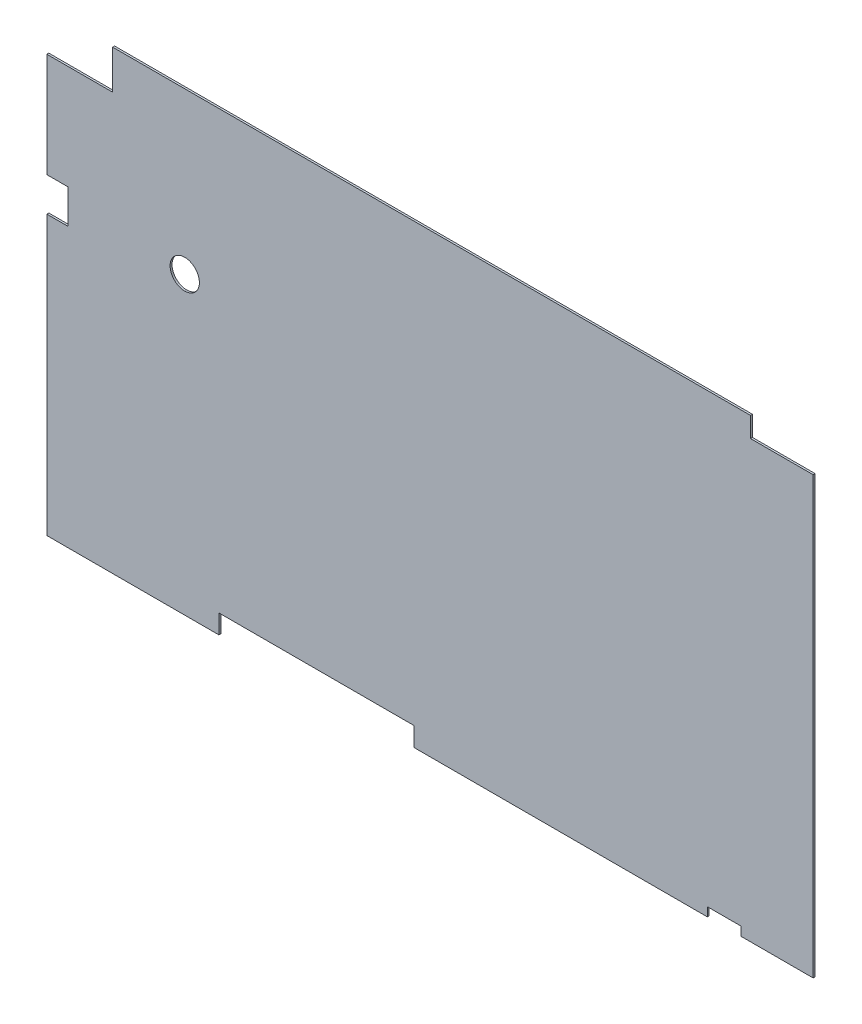
ISO-10303-21;
HEADER;
FILE_DESCRIPTION(('STEP AP214'),'2;1');
FILE_NAME('part.step','',(''),(''),'','','');
FILE_SCHEMA(('AUTOMOTIVE_DESIGN { 1 0 10303 214 1 1 1 1 }'));
ENDSEC;
DATA;
#1=APPLICATION_CONTEXT('core data for automotive mechanical design processes');
#2=APPLICATION_PROTOCOL_DEFINITION('international standard','automotive_design',2000,#1);
#3=PRODUCT_CONTEXT('',#1,'mechanical');
#4=PRODUCT('Part','Part','',(#3));
#5=PRODUCT_RELATED_PRODUCT_CATEGORY('part','',(#4));
#6=PRODUCT_DEFINITION_FORMATION('','',#4);
#7=PRODUCT_DEFINITION_CONTEXT('part definition',#1,'design');
#8=PRODUCT_DEFINITION('design','',#6,#7);
#9=PRODUCT_DEFINITION_SHAPE('','',#8);
#10=(LENGTH_UNIT() NAMED_UNIT(*) SI_UNIT(.MILLI.,.METRE.));
#11=(NAMED_UNIT(*) PLANE_ANGLE_UNIT() SI_UNIT($,.RADIAN.));
#12=(NAMED_UNIT(*) SI_UNIT($,.STERADIAN.) SOLID_ANGLE_UNIT());
#13=UNCERTAINTY_MEASURE_WITH_UNIT(LENGTH_MEASURE(1.E-05),#10,'distance_accuracy_value','');
#14=(GEOMETRIC_REPRESENTATION_CONTEXT(3) GLOBAL_UNCERTAINTY_ASSIGNED_CONTEXT((#13)) GLOBAL_UNIT_ASSIGNED_CONTEXT((#10,
#11,#12)) REPRESENTATION_CONTEXT('',''));
#15=CARTESIAN_POINT('',(0.,0.,0.));
#16=DIRECTION('',(0.,0.,1.));
#17=DIRECTION('',(1.,0.,0.));
#18=AXIS2_PLACEMENT_3D('',#15,#16,#17);
#19=CARTESIAN_POINT('',(-271.1665276998,265.1245773803,-2.3000003809536));
#20=DIRECTION('',(0.,0.,-1.));
#21=DIRECTION('',(0.,-1.,0.));
#22=AXIS2_PLACEMENT_3D('',#19,#20,#21);
#23=CYLINDRICAL_SURFACE('',#22,3.);
#24=CARTESIAN_POINT('',(-271.1665276998,265.1245773803,-4.8));
#25=DIRECTION('',(0.,0.,1.));
#26=DIRECTION('',(0.,1.,0.));
#27=AXIS2_PLACEMENT_3D('',#24,#25,#26);
#28=CIRCLE('',#27,3.);
#29=CARTESIAN_POINT('',(-271.1665276998,268.1245773803,-4.8));
#30=VERTEX_POINT('',#29);
#31=CARTESIAN_POINT('',(-271.1665276998,262.1245773803,-4.8));
#32=VERTEX_POINT('',#31);
#33=EDGE_CURVE('E395',#30,#32,#28,.T.);
#34=ORIENTED_EDGE('',*,*,#33,.F.);
#35=DIRECTION('',(0.,0.,1.));
#36=VECTOR('',#35,1.);
#37=CARTESIAN_POINT('',(-271.1665276998,268.1245773803,-4.8));
#38=LINE('',#37,#36);
#39=CARTESIAN_POINT('',(-271.1665276998,268.1245773803,-4.4));
#40=VERTEX_POINT('',#39);
#41=EDGE_CURVE('E25',#30,#40,#38,.T.);
#42=ORIENTED_EDGE('',*,*,#41,.T.);
#43=CARTESIAN_POINT('',(-271.1665276998,265.1245773803,-4.4));
#44=DIRECTION('',(0.,0.,-1.));
#45=DIRECTION('',(0.,-1.,0.));
#46=AXIS2_PLACEMENT_3D('',#43,#44,#45);
#47=CIRCLE('',#46,3.);
#48=CARTESIAN_POINT('',(-271.1665276998,262.1245773803,-4.4));
#49=VERTEX_POINT('',#48);
#50=EDGE_CURVE('E208',#49,#40,#47,.T.);
#51=ORIENTED_EDGE('',*,*,#50,.F.);
#52=DIRECTION('',(0.,0.,1.));
#53=VECTOR('',#52,1.);
#54=CARTESIAN_POINT('',(-271.1665276998,262.1245773803,-4.8));
#55=LINE('',#54,#53);
#56=EDGE_CURVE('E11',#32,#49,#55,.T.);
#57=ORIENTED_EDGE('',*,*,#56,.F.);
#58=EDGE_LOOP('',(#34,#42,#51,#57));
#59=FACE_BOUND('',#58,.T.);
#60=ADVANCED_FACE('F17',(#59),#23,.F.);
#61=CARTESIAN_POINT('',(-271.1665276998,265.1245773803,-2.3000003809536));
#62=DIRECTION('',(0.,0.,-1.));
#63=DIRECTION('',(0.,-1.,0.));
#64=AXIS2_PLACEMENT_3D('',#61,#62,#63);
#65=CYLINDRICAL_SURFACE('',#64,3.);
#66=ORIENTED_EDGE('',*,*,#41,.F.);
#67=CARTESIAN_POINT('',(-271.1665276998,265.1245773803,-4.8));
#68=DIRECTION('',(0.,0.,1.));
#69=DIRECTION('',(0.,-1.,0.));
#70=AXIS2_PLACEMENT_3D('',#67,#68,#69);
#71=CIRCLE('',#70,3.);
#72=EDGE_CURVE('E399',#32,#30,#71,.T.);
#73=ORIENTED_EDGE('',*,*,#72,.F.);
#74=ORIENTED_EDGE('',*,*,#56,.T.);
#75=CARTESIAN_POINT('',(-271.1665276998,265.1245773803,-4.4));
#76=DIRECTION('',(0.,0.,-1.));
#77=DIRECTION('',(0.,1.,0.));
#78=AXIS2_PLACEMENT_3D('',#75,#76,#77);
#79=CIRCLE('',#78,3.);
#80=EDGE_CURVE('E212',#40,#49,#79,.T.);
#81=ORIENTED_EDGE('',*,*,#80,.F.);
#82=EDGE_LOOP('',(#66,#73,#74,#81));
#83=FACE_BOUND('',#82,.T.);
#84=ADVANCED_FACE('F832',(#83),#65,.F.);
#85=CARTESIAN_POINT('',(-155.2561352154,293.9152379398,-4.840005546));
#86=DIRECTION('',(-1.,0.,0.));
#87=DIRECTION('',(0.,0.,1.));
#88=AXIS2_PLACEMENT_3D('',#85,#86,#87);
#89=PLANE('',#88);
#90=DIRECTION('',(0.,0.,-1.));
#91=VECTOR('',#90,1.);
#92=CARTESIAN_POINT('',(-155.2561352154,293.9152379398,-4.4));
#93=LINE('',#92,#91);
#94=CARTESIAN_POINT('',(-155.2561352154,293.9152379398,-4.4));
#95=VERTEX_POINT('',#94);
#96=CARTESIAN_POINT('',(-155.2561352154,293.9152379398,-4.8));
#97=VERTEX_POINT('',#96);
#98=EDGE_CURVE('E348',#95,#97,#93,.T.);
#99=ORIENTED_EDGE('',*,*,#98,.T.);
#100=DIRECTION('',(0.,-1.,0.));
#101=VECTOR('',#100,1.);
#102=CARTESIAN_POINT('',(-155.2561352154,298.0245785123,-4.8));
#103=LINE('',#102,#101);
#104=CARTESIAN_POINT('',(-155.2561352154,298.0245785123,-4.8));
#105=VERTEX_POINT('',#104);
#106=EDGE_CURVE('E384',#105,#97,#103,.T.);
#107=ORIENTED_EDGE('',*,*,#106,.F.);
#108=DIRECTION('',(0.,0.,1.));
#109=VECTOR('',#108,1.);
#110=CARTESIAN_POINT('',(-155.2561352154,298.0245785123,-4.8));
#111=LINE('',#110,#109);
#112=CARTESIAN_POINT('',(-155.2561352154,298.0245785123,-4.4));
#113=VERTEX_POINT('',#112);
#114=EDGE_CURVE('E215',#105,#113,#111,.T.);
#115=ORIENTED_EDGE('',*,*,#114,.T.);
#116=DIRECTION('',(0.,-1.,0.));
#117=VECTOR('',#116,1.);
#118=CARTESIAN_POINT('',(-155.2561352154,298.0245785123,-4.4));
#119=LINE('',#118,#117);
#120=EDGE_CURVE('E185',#113,#95,#119,.T.);
#121=ORIENTED_EDGE('',*,*,#120,.T.);
#122=EDGE_LOOP('',(#99,#107,#115,#121));
#123=FACE_BOUND('',#122,.T.);
#124=ADVANCED_FACE('F809',(#123),#89,.F.);
#125=CARTESIAN_POINT('',(-157.2215265136,204.6245785127,-4.8));
#126=DIRECTION('',(0.,1.,0.));
#127=DIRECTION('',(1.,0.,0.));
#128=AXIS2_PLACEMENT_3D('',#125,#126,#127);
#129=PLANE('',#128);
#130=DIRECTION('',(1.,0.,0.));
#131=VECTOR('',#130,1.);
#132=CARTESIAN_POINT('',(-157.2215265136,204.6245785127,-4.4));
#133=LINE('',#132,#131);
#134=CARTESIAN_POINT('',(-157.2215265136,204.6245785127,-4.4));
#135=VERTEX_POINT('',#134);
#136=CARTESIAN_POINT('',(-142.4165265142,204.6245785127,-4.4));
#137=VERTEX_POINT('',#136);
#138=EDGE_CURVE('E178',#135,#137,#133,.T.);
#139=ORIENTED_EDGE('',*,*,#138,.F.);
#140=DIRECTION('',(0.,0.,1.));
#141=VECTOR('',#140,1.);
#142=CARTESIAN_POINT('',(-157.2215265136,204.6245785127,-4.8));
#143=LINE('',#142,#141);
#144=CARTESIAN_POINT('',(-157.2215265136,204.6245785127,-4.8));
#145=VERTEX_POINT('',#144);
#146=EDGE_CURVE('E164',#145,#135,#143,.T.);
#147=ORIENTED_EDGE('',*,*,#146,.F.);
#148=DIRECTION('',(1.,0.,0.));
#149=VECTOR('',#148,1.);
#150=CARTESIAN_POINT('',(-157.2215265136,204.6245785127,-4.8));
#151=LINE('',#150,#149);
#152=CARTESIAN_POINT('',(-142.4165265142,204.6245785127,-4.8));
#153=VERTEX_POINT('',#152);
#154=EDGE_CURVE('E324',#145,#153,#151,.T.);
#155=ORIENTED_EDGE('',*,*,#154,.T.);
#156=DIRECTION('',(0.,0.,-1.));
#157=VECTOR('',#156,1.);
#158=CARTESIAN_POINT('',(-142.4165265142,204.6245785127,-4.4));
#159=LINE('',#158,#157);
#160=EDGE_CURVE('E180',#137,#153,#159,.T.);
#161=ORIENTED_EDGE('',*,*,#160,.F.);
#162=EDGE_LOOP('',(#139,#147,#155,#161));
#163=FACE_BOUND('',#162,.T.);
#164=ADVANCED_FACE('F179',(#163),#129,.F.);
#165=CARTESIAN_POINT('',(-157.2215265136,206.4345785127,-4.8));
#166=DIRECTION('',(1.,0.,0.));
#167=DIRECTION('',(0.,1.,0.));
#168=AXIS2_PLACEMENT_3D('',#165,#166,#167);
#169=PLANE('',#168);
#170=DIRECTION('',(0.,-1.,0.));
#171=VECTOR('',#170,1.);
#172=CARTESIAN_POINT('',(-157.2215265136,206.4345785127,-4.4));
#173=LINE('',#172,#171);
#174=CARTESIAN_POINT('',(-157.2215265136,206.4345785127,-4.4));
#175=VERTEX_POINT('',#174);
#176=EDGE_CURVE('E168',#175,#135,#173,.T.);
#177=ORIENTED_EDGE('',*,*,#176,.F.);
#178=DIRECTION('',(0.,0.,-1.));
#179=VECTOR('',#178,1.);
#180=CARTESIAN_POINT('',(-157.2215265136,206.4345785127,-4.4));
#181=LINE('',#180,#179);
#182=CARTESIAN_POINT('',(-157.2215265136,206.4345785127,-4.8));
#183=VERTEX_POINT('',#182);
#184=EDGE_CURVE('E176',#175,#183,#181,.T.);
#185=ORIENTED_EDGE('',*,*,#184,.T.);
#186=DIRECTION('',(0.,-1.,0.));
#187=VECTOR('',#186,1.);
#188=CARTESIAN_POINT('',(-157.2215265136,206.4345785127,-4.8));
#189=LINE('',#188,#187);
#190=EDGE_CURVE('E171',#183,#145,#189,.T.);
#191=ORIENTED_EDGE('',*,*,#190,.T.);
#192=ORIENTED_EDGE('',*,*,#146,.T.);
#193=EDGE_LOOP('',(#177,#185,#191,#192));
#194=FACE_BOUND('',#193,.T.);
#195=ADVANCED_FACE('F166',(#194),#169,.F.);
#196=CARTESIAN_POINT('',(-164.1115265136,206.4345785127,-4.8));
#197=DIRECTION('',(0.,1.,0.));
#198=DIRECTION('',(1.,0.,0.));
#199=AXIS2_PLACEMENT_3D('',#196,#197,#198);
#200=PLANE('',#199);
#201=DIRECTION('',(1.,0.,0.));
#202=VECTOR('',#201,1.);
#203=CARTESIAN_POINT('',(-164.1115265136,206.4345785127,-4.4));
#204=LINE('',#203,#202);
#205=CARTESIAN_POINT('',(-164.1115265136,206.4345785127,-4.4));
#206=VERTEX_POINT('',#205);
#207=EDGE_CURVE('E191',#206,#175,#204,.T.);
#208=ORIENTED_EDGE('',*,*,#207,.F.);
#209=DIRECTION('',(0.,0.,-1.));
#210=VECTOR('',#209,1.);
#211=CARTESIAN_POINT('',(-164.1115265136,206.4345785127,-4.4));
#212=LINE('',#211,#210);
#213=CARTESIAN_POINT('',(-164.1115265136,206.4345785127,-4.8));
#214=VERTEX_POINT('',#213);
#215=EDGE_CURVE('E255',#206,#214,#212,.T.);
#216=ORIENTED_EDGE('',*,*,#215,.T.);
#217=DIRECTION('',(1.,0.,0.));
#218=VECTOR('',#217,1.);
#219=CARTESIAN_POINT('',(-164.1115265136,206.4345785127,-4.8));
#220=LINE('',#219,#218);
#221=EDGE_CURVE('E318',#214,#183,#220,.T.);
#222=ORIENTED_EDGE('',*,*,#221,.T.);
#223=ORIENTED_EDGE('',*,*,#184,.F.);
#224=EDGE_LOOP('',(#208,#216,#222,#223));
#225=FACE_BOUND('',#224,.T.);
#226=ADVANCED_FACE('F317',(#225),#200,.F.);
#227=CARTESIAN_POINT('',(-164.1115265136,204.6245785127,-4.8));
#228=DIRECTION('',(-1.,0.,0.));
#229=DIRECTION('',(0.,0.,1.));
#230=AXIS2_PLACEMENT_3D('',#227,#228,#229);
#231=PLANE('',#230);
#232=DIRECTION('',(0.,1.,0.));
#233=VECTOR('',#232,1.);
#234=CARTESIAN_POINT('',(-164.1115265136,204.6245785127,-4.4));
#235=LINE('',#234,#233);
#236=CARTESIAN_POINT('',(-164.1115265136,204.6245785127,-4.4));
#237=VERTEX_POINT('',#236);
#238=EDGE_CURVE('E198',#237,#206,#235,.T.);
#239=ORIENTED_EDGE('',*,*,#238,.F.);
#240=DIRECTION('',(0.,0.,-1.));
#241=VECTOR('',#240,1.);
#242=CARTESIAN_POINT('',(-164.1115265136,204.6245785127,-4.4));
#243=LINE('',#242,#241);
#244=CARTESIAN_POINT('',(-164.1115265136,204.6245785127,-4.8));
#245=VERTEX_POINT('',#244);
#246=EDGE_CURVE('E254',#237,#245,#243,.T.);
#247=ORIENTED_EDGE('',*,*,#246,.T.);
#248=DIRECTION('',(0.,1.,0.));
#249=VECTOR('',#248,1.);
#250=CARTESIAN_POINT('',(-164.1115265136,204.6245785127,-4.8));
#251=LINE('',#250,#249);
#252=EDGE_CURVE('E315',#245,#214,#251,.T.);
#253=ORIENTED_EDGE('',*,*,#252,.T.);
#254=ORIENTED_EDGE('',*,*,#215,.F.);
#255=EDGE_LOOP('',(#239,#247,#253,#254));
#256=FACE_BOUND('',#255,.T.);
#257=ADVANCED_FACE('F313',(#256),#231,.F.);
#258=CARTESIAN_POINT('',(-224.1665256919,204.6245785127,-4.8));
#259=DIRECTION('',(0.,1.,0.));
#260=DIRECTION('',(1.,0.,0.));
#261=AXIS2_PLACEMENT_3D('',#258,#259,#260);
#262=PLANE('',#261);
#263=DIRECTION('',(1.,0.,0.));
#264=VECTOR('',#263,1.);
#265=CARTESIAN_POINT('',(-224.1665256919,204.6245785127,-4.4));
#266=LINE('',#265,#264);
#267=CARTESIAN_POINT('',(-224.1665256919,204.6245785127,-4.4));
#268=VERTEX_POINT('',#267);
#269=EDGE_CURVE('E306',#268,#237,#266,.T.);
#270=ORIENTED_EDGE('',*,*,#269,.F.);
#271=DIRECTION('',(0.,0.,1.));
#272=VECTOR('',#271,1.);
#273=CARTESIAN_POINT('',(-224.1665256919,204.6245785127,-4.8));
#274=LINE('',#273,#272);
#275=CARTESIAN_POINT('',(-224.1665256919,204.6245785127,-4.8));
#276=VERTEX_POINT('',#275);
#277=EDGE_CURVE('E251',#276,#268,#274,.T.);
#278=ORIENTED_EDGE('',*,*,#277,.F.);
#279=DIRECTION('',(1.,0.,0.));
#280=VECTOR('',#279,1.);
#281=CARTESIAN_POINT('',(-224.1665256919,204.6245785127,-4.8));
#282=LINE('',#281,#280);
#283=EDGE_CURVE('E372',#276,#245,#282,.T.);
#284=ORIENTED_EDGE('',*,*,#283,.T.);
#285=ORIENTED_EDGE('',*,*,#246,.F.);
#286=EDGE_LOOP('',(#270,#278,#284,#285));
#287=FACE_BOUND('',#286,.T.);
#288=ADVANCED_FACE('F474',(#287),#262,.F.);
#289=CARTESIAN_POINT('',(-224.1665256919,208.5245785446,-4.8));
#290=DIRECTION('',(1.,0.,0.));
#291=DIRECTION('',(0.,1.,0.));
#292=AXIS2_PLACEMENT_3D('',#289,#290,#291);
#293=PLANE('',#292);
#294=DIRECTION('',(0.,-1.,0.));
#295=VECTOR('',#294,1.);
#296=CARTESIAN_POINT('',(-224.1665256919,208.5245785446,-4.4));
#297=LINE('',#296,#295);
#298=CARTESIAN_POINT('',(-224.1665256919,208.5245785446,-4.4));
#299=VERTEX_POINT('',#298);
#300=EDGE_CURVE('E300',#299,#268,#297,.T.);
#301=ORIENTED_EDGE('',*,*,#300,.F.);
#302=DIRECTION('',(0.,0.,-1.));
#303=VECTOR('',#302,1.);
#304=CARTESIAN_POINT('',(-224.1665256919,208.5245785446,-4.4));
#305=LINE('',#304,#303);
#306=CARTESIAN_POINT('',(-224.1665256919,208.5245785446,-4.8));
#307=VERTEX_POINT('',#306);
#308=EDGE_CURVE('E248',#299,#307,#305,.T.);
#309=ORIENTED_EDGE('',*,*,#308,.T.);
#310=DIRECTION('',(0.,-1.,0.));
#311=VECTOR('',#310,1.);
#312=CARTESIAN_POINT('',(-224.1665256919,208.5245785446,-4.8));
#313=LINE('',#312,#311);
#314=EDGE_CURVE('E335',#307,#276,#313,.T.);
#315=ORIENTED_EDGE('',*,*,#314,.T.);
#316=ORIENTED_EDGE('',*,*,#277,.T.);
#317=EDGE_LOOP('',(#301,#309,#315,#316));
#318=FACE_BOUND('',#317,.T.);
#319=ADVANCED_FACE('F471',(#318),#293,.F.);
#320=CARTESIAN_POINT('',(-264.1665257238,208.5245785446,-4.8));
#321=DIRECTION('',(0.,1.,0.));
#322=DIRECTION('',(1.,0.,0.));
#323=AXIS2_PLACEMENT_3D('',#320,#321,#322);
#324=PLANE('',#323);
#325=DIRECTION('',(1.,0.,0.));
#326=VECTOR('',#325,1.);
#327=CARTESIAN_POINT('',(-264.1665257238,208.5245785446,-4.4));
#328=LINE('',#327,#326);
#329=CARTESIAN_POINT('',(-264.1665257238,208.5245785446,-4.4));
#330=VERTEX_POINT('',#329);
#331=EDGE_CURVE('E296',#330,#299,#328,.T.);
#332=ORIENTED_EDGE('',*,*,#331,.F.);
#333=DIRECTION('',(0.,0.,-1.));
#334=VECTOR('',#333,1.);
#335=CARTESIAN_POINT('',(-264.1665257238,208.5245785446,-4.4));
#336=LINE('',#335,#334);
#337=CARTESIAN_POINT('',(-264.1665257238,208.5245785446,-4.8));
#338=VERTEX_POINT('',#337);
#339=EDGE_CURVE('E245',#330,#338,#336,.T.);
#340=ORIENTED_EDGE('',*,*,#339,.T.);
#341=DIRECTION('',(1.,0.,0.));
#342=VECTOR('',#341,1.);
#343=CARTESIAN_POINT('',(-264.1665257238,208.5245785446,-4.8));
#344=LINE('',#343,#342);
#345=EDGE_CURVE('E353',#338,#307,#344,.T.);
#346=ORIENTED_EDGE('',*,*,#345,.T.);
#347=ORIENTED_EDGE('',*,*,#308,.F.);
#348=EDGE_LOOP('',(#332,#340,#346,#347));
#349=FACE_BOUND('',#348,.T.);
#350=ADVANCED_FACE('F466',(#349),#324,.F.);
#351=CARTESIAN_POINT('',(-264.1665257238,204.6245785127,-4.8));
#352=DIRECTION('',(-1.,0.,0.));
#353=DIRECTION('',(0.,0.,1.));
#354=AXIS2_PLACEMENT_3D('',#351,#352,#353);
#355=PLANE('',#354);
#356=DIRECTION('',(0.,1.,0.));
#357=VECTOR('',#356,1.);
#358=CARTESIAN_POINT('',(-264.1665257238,204.6245785127,-4.4));
#359=LINE('',#358,#357);
#360=CARTESIAN_POINT('',(-264.1665257238,204.6245785127,-4.4));
#361=VERTEX_POINT('',#360);
#362=EDGE_CURVE('E292',#361,#330,#359,.T.);
#363=ORIENTED_EDGE('',*,*,#362,.F.);
#364=DIRECTION('',(0.,0.,-1.));
#365=VECTOR('',#364,1.);
#366=CARTESIAN_POINT('',(-264.1665257238,204.6245785127,-4.4));
#367=LINE('',#366,#365);
#368=CARTESIAN_POINT('',(-264.1665257238,204.6245785127,-4.8));
#369=VERTEX_POINT('',#368);
#370=EDGE_CURVE('E242',#361,#369,#367,.T.);
#371=ORIENTED_EDGE('',*,*,#370,.T.);
#372=DIRECTION('',(0.,1.,0.));
#373=VECTOR('',#372,1.);
#374=CARTESIAN_POINT('',(-264.1665257238,204.6245785127,-4.8));
#375=LINE('',#374,#373);
#376=EDGE_CURVE('E356',#369,#338,#375,.T.);
#377=ORIENTED_EDGE('',*,*,#376,.T.);
#378=ORIENTED_EDGE('',*,*,#339,.F.);
#379=EDGE_LOOP('',(#363,#371,#377,#378));
#380=FACE_BOUND('',#379,.T.);
#381=ADVANCED_FACE('F462',(#380),#355,.F.);
#382=CARTESIAN_POINT('',(-299.4165265136,204.6245785127,-4.8));
#383=DIRECTION('',(0.,1.,0.));
#384=DIRECTION('',(1.,0.,0.));
#385=AXIS2_PLACEMENT_3D('',#382,#383,#384);
#386=PLANE('',#385);
#387=DIRECTION('',(1.,0.,0.));
#388=VECTOR('',#387,1.);
#389=CARTESIAN_POINT('',(-299.4165265136,204.6245785127,-4.4));
#390=LINE('',#389,#388);
#391=CARTESIAN_POINT('',(-299.4165265136,204.6245785127,-4.4));
#392=VERTEX_POINT('',#391);
#393=EDGE_CURVE('E288',#392,#361,#390,.T.);
#394=ORIENTED_EDGE('',*,*,#393,.F.);
#395=DIRECTION('',(0.,0.,1.));
#396=VECTOR('',#395,1.);
#397=CARTESIAN_POINT('',(-299.4165265136,204.6245785127,-4.8));
#398=LINE('',#397,#396);
#399=CARTESIAN_POINT('',(-299.4165265136,204.6245785127,-4.8));
#400=VERTEX_POINT('',#399);
#401=EDGE_CURVE('E239',#400,#392,#398,.T.);
#402=ORIENTED_EDGE('',*,*,#401,.F.);
#403=DIRECTION('',(1.,0.,0.));
#404=VECTOR('',#403,1.);
#405=CARTESIAN_POINT('',(-299.4165265136,204.6245785127,-4.8));
#406=LINE('',#405,#404);
#407=EDGE_CURVE('E368',#400,#369,#406,.T.);
#408=ORIENTED_EDGE('',*,*,#407,.T.);
#409=ORIENTED_EDGE('',*,*,#370,.F.);
#410=EDGE_LOOP('',(#394,#402,#408,#409));
#411=FACE_BOUND('',#410,.T.);
#412=ADVANCED_FACE('F458',(#411),#386,.F.);
#413=CARTESIAN_POINT('',(-299.4165265136,290.0245785123,-4.8));
#414=DIRECTION('',(1.,0.,0.));
#415=DIRECTION('',(0.,1.,0.));
#416=AXIS2_PLACEMENT_3D('',#413,#414,#415);
#417=PLANE('',#416);
#418=DIRECTION('',(0.,1.,0.));
#419=VECTOR('',#418,1.);
#420=CARTESIAN_POINT('',(-299.4165265136,204.6245785127,-4.4));
#421=LINE('',#420,#419);
#422=CARTESIAN_POINT('',(-299.4165265136,261.6545785123,-4.4));
#423=VERTEX_POINT('',#422);
#424=EDGE_CURVE('E284',#392,#423,#421,.T.);
#425=ORIENTED_EDGE('',*,*,#424,.T.);
#426=DIRECTION('',(0.,0.,1.));
#427=VECTOR('',#426,1.);
#428=CARTESIAN_POINT('',(-299.4165265136,261.6545785123,-4.8));
#429=LINE('',#428,#427);
#430=CARTESIAN_POINT('',(-299.4165265136,261.6545785123,-4.8));
#431=VERTEX_POINT('',#430);
#432=EDGE_CURVE('E236',#431,#423,#429,.T.);
#433=ORIENTED_EDGE('',*,*,#432,.F.);
#434=DIRECTION('',(0.,1.,0.));
#435=VECTOR('',#434,1.);
#436=CARTESIAN_POINT('',(-299.4165265136,204.6245785127,-4.8));
#437=LINE('',#436,#435);
#438=EDGE_CURVE('E347',#400,#431,#437,.T.);
#439=ORIENTED_EDGE('',*,*,#438,.F.);
#440=ORIENTED_EDGE('',*,*,#401,.T.);
#441=EDGE_LOOP('',(#425,#433,#439,#440));
#442=FACE_BOUND('',#441,.T.);
#443=ADVANCED_FACE('F454',(#442),#417,.F.);
#444=CARTESIAN_POINT('',(-295.0665265136,261.6545785123,-4.8400024));
#445=DIRECTION('',(0.,-1.,0.));
#446=DIRECTION('',(0.,0.,-1.));
#447=AXIS2_PLACEMENT_3D('',#444,#445,#446);
#448=PLANE('',#447);
#449=DIRECTION('',(0.,0.,-1.));
#450=VECTOR('',#449,1.);
#451=CARTESIAN_POINT('',(-295.0665265136,261.6545785123,-4.4));
#452=LINE('',#451,#450);
#453=CARTESIAN_POINT('',(-295.0665265136,261.6545785123,-4.4));
#454=VERTEX_POINT('',#453);
#455=CARTESIAN_POINT('',(-295.0665265136,261.6545785123,-4.8));
#456=VERTEX_POINT('',#455);
#457=EDGE_CURVE('E233',#454,#456,#452,.T.);
#458=ORIENTED_EDGE('',*,*,#457,.T.);
#459=DIRECTION('',(1.,0.,0.));
#460=VECTOR('',#459,1.);
#461=CARTESIAN_POINT('',(-299.4165265136,261.6545785123,-4.8));
#462=LINE('',#461,#460);
#463=EDGE_CURVE('E342',#431,#456,#462,.T.);
#464=ORIENTED_EDGE('',*,*,#463,.F.);
#465=ORIENTED_EDGE('',*,*,#432,.T.);
#466=DIRECTION('',(1.,0.,0.));
#467=VECTOR('',#466,1.);
#468=CARTESIAN_POINT('',(-299.4165265136,261.6545785123,-4.4));
#469=LINE('',#468,#467);
#470=EDGE_CURVE('E280',#423,#454,#469,.T.);
#471=ORIENTED_EDGE('',*,*,#470,.T.);
#472=EDGE_LOOP('',(#458,#464,#465,#471));
#473=FACE_BOUND('',#472,.T.);
#474=ADVANCED_FACE('F451',(#473),#448,.F.);
#475=CARTESIAN_POINT('',(-295.0665265136,268.6545785123,-4.8400024));
#476=DIRECTION('',(1.,0.,0.));
#477=DIRECTION('',(0.,1.,0.));
#478=AXIS2_PLACEMENT_3D('',#475,#476,#477);
#479=PLANE('',#478);
#480=DIRECTION('',(0.,0.,-1.));
#481=VECTOR('',#480,1.);
#482=CARTESIAN_POINT('',(-295.0665265136,268.6545785123,-4.4));
#483=LINE('',#482,#481);
#484=CARTESIAN_POINT('',(-295.0665265136,268.6545785123,-4.4));
#485=VERTEX_POINT('',#484);
#486=CARTESIAN_POINT('',(-295.0665265136,268.6545785123,-4.8));
#487=VERTEX_POINT('',#486);
#488=EDGE_CURVE('E230',#485,#487,#483,.T.);
#489=ORIENTED_EDGE('',*,*,#488,.T.);
#490=DIRECTION('',(0.,1.,0.));
#491=VECTOR('',#490,1.);
#492=CARTESIAN_POINT('',(-295.0665265136,261.6545785123,-4.8));
#493=LINE('',#492,#491);
#494=EDGE_CURVE('E346',#456,#487,#493,.T.);
#495=ORIENTED_EDGE('',*,*,#494,.F.);
#496=ORIENTED_EDGE('',*,*,#457,.F.);
#497=DIRECTION('',(0.,1.,0.));
#498=VECTOR('',#497,1.);
#499=CARTESIAN_POINT('',(-295.0665265136,261.6545785123,-4.4));
#500=LINE('',#499,#498);
#501=EDGE_CURVE('E277',#454,#485,#500,.T.);
#502=ORIENTED_EDGE('',*,*,#501,.T.);
#503=EDGE_LOOP('',(#489,#495,#496,#502));
#504=FACE_BOUND('',#503,.T.);
#505=ADVANCED_FACE('F447',(#504),#479,.F.);
#506=CARTESIAN_POINT('',(-302.0665265136,268.6545785123,-4.8400024));
#507=DIRECTION('',(0.,1.,0.));
#508=DIRECTION('',(1.,0.,0.));
#509=AXIS2_PLACEMENT_3D('',#506,#507,#508);
#510=PLANE('',#509);
#511=DIRECTION('',(0.,0.,-1.));
#512=VECTOR('',#511,1.);
#513=CARTESIAN_POINT('',(-299.4165265136,268.6545785123,-4.4));
#514=LINE('',#513,#512);
#515=CARTESIAN_POINT('',(-299.4165265136,268.6545785123,-4.4));
#516=VERTEX_POINT('',#515);
#517=CARTESIAN_POINT('',(-299.4165265136,268.6545785123,-4.8));
#518=VERTEX_POINT('',#517);
#519=EDGE_CURVE('E227',#516,#518,#514,.T.);
#520=ORIENTED_EDGE('',*,*,#519,.T.);
#521=DIRECTION('',(-1.,0.,0.));
#522=VECTOR('',#521,1.);
#523=CARTESIAN_POINT('',(-295.0665265136,268.6545785123,-4.8));
#524=LINE('',#523,#522);
#525=EDGE_CURVE('E365',#487,#518,#524,.T.);
#526=ORIENTED_EDGE('',*,*,#525,.F.);
#527=ORIENTED_EDGE('',*,*,#488,.F.);
#528=DIRECTION('',(-1.,0.,0.));
#529=VECTOR('',#528,1.);
#530=CARTESIAN_POINT('',(-295.0665265136,268.6545785123,-4.4));
#531=LINE('',#530,#529);
#532=EDGE_CURVE('E275',#485,#516,#531,.T.);
#533=ORIENTED_EDGE('',*,*,#532,.T.);
#534=EDGE_LOOP('',(#520,#526,#527,#533));
#535=FACE_BOUND('',#534,.T.);
#536=ADVANCED_FACE('F428',(#535),#510,.F.);
#537=CARTESIAN_POINT('',(-299.4165265136,290.0245785123,-4.8));
#538=DIRECTION('',(1.,0.,0.));
#539=DIRECTION('',(0.,1.,0.));
#540=AXIS2_PLACEMENT_3D('',#537,#538,#539);
#541=PLANE('',#540);
#542=DIRECTION('',(0.,1.,0.));
#543=VECTOR('',#542,1.);
#544=CARTESIAN_POINT('',(-299.4165265136,268.6545785123,-4.4));
#545=LINE('',#544,#543);
#546=CARTESIAN_POINT('',(-299.4165265136,290.0245785123,-4.4));
#547=VERTEX_POINT('',#546);
#548=EDGE_CURVE('E416',#516,#547,#545,.T.);
#549=ORIENTED_EDGE('',*,*,#548,.T.);
#550=DIRECTION('',(0.,0.,-1.));
#551=VECTOR('',#550,1.);
#552=CARTESIAN_POINT('',(-299.4165265136,290.0245785123,-4.4));
#553=LINE('',#552,#551);
#554=CARTESIAN_POINT('',(-299.4165265136,290.0245785123,-4.8));
#555=VERTEX_POINT('',#554);
#556=EDGE_CURVE('E224',#547,#555,#553,.T.);
#557=ORIENTED_EDGE('',*,*,#556,.T.);
#558=DIRECTION('',(0.,1.,0.));
#559=VECTOR('',#558,1.);
#560=CARTESIAN_POINT('',(-299.4165265136,268.6545785123,-4.8));
#561=LINE('',#560,#559);
#562=EDGE_CURVE('E341',#518,#555,#561,.T.);
#563=ORIENTED_EDGE('',*,*,#562,.F.);
#564=ORIENTED_EDGE('',*,*,#519,.F.);
#565=EDGE_LOOP('',(#549,#557,#563,#564));
#566=FACE_BOUND('',#565,.T.);
#567=ADVANCED_FACE('F440',(#566),#541,.F.);
#568=CARTESIAN_POINT('',(-287.933831,290.0245785123,-4.8));
#569=DIRECTION('',(0.,-1.,0.));
#570=DIRECTION('',(0.,0.,-1.));
#571=AXIS2_PLACEMENT_3D('',#568,#569,#570);
#572=PLANE('',#571);
#573=DIRECTION('',(-1.,0.,0.));
#574=VECTOR('',#573,1.);
#575=CARTESIAN_POINT('',(-285.933831,290.0245785123,-4.4));
#576=LINE('',#575,#574);
#577=CARTESIAN_POINT('',(-285.933831,290.0245785123,-4.4));
#578=VERTEX_POINT('',#577);
#579=EDGE_CURVE('E413',#578,#547,#576,.T.);
#580=ORIENTED_EDGE('',*,*,#579,.F.);
#581=DIRECTION('',(0.,0.,-1.));
#582=VECTOR('',#581,1.);
#583=CARTESIAN_POINT('',(-285.933831,290.0245785123,-4.4));
#584=LINE('',#583,#582);
#585=CARTESIAN_POINT('',(-285.933831,290.0245785123,-4.8));
#586=VERTEX_POINT('',#585);
#587=EDGE_CURVE('E221',#578,#586,#584,.T.);
#588=ORIENTED_EDGE('',*,*,#587,.T.);
#589=DIRECTION('',(-1.,0.,0.));
#590=VECTOR('',#589,1.);
#591=CARTESIAN_POINT('',(-285.933831,290.0245785123,-4.8));
#592=LINE('',#591,#590);
#593=EDGE_CURVE('E337',#586,#555,#592,.T.);
#594=ORIENTED_EDGE('',*,*,#593,.T.);
#595=ORIENTED_EDGE('',*,*,#556,.F.);
#596=EDGE_LOOP('',(#580,#588,#594,#595));
#597=FACE_BOUND('',#596,.T.);
#598=ADVANCED_FACE('F436',(#597),#572,.F.);
#599=CARTESIAN_POINT('',(-285.933831,299.0245785123,-4.8));
#600=DIRECTION('',(1.,0.,0.));
#601=DIRECTION('',(0.,1.,0.));
#602=AXIS2_PLACEMENT_3D('',#599,#600,#601);
#603=PLANE('',#602);
#604=DIRECTION('',(0.,1.,0.));
#605=VECTOR('',#604,1.);
#606=CARTESIAN_POINT('',(-285.933831,290.0245785123,-4.4));
#607=LINE('',#606,#605);
#608=CARTESIAN_POINT('',(-285.933831,298.0245785123,-4.4));
#609=VERTEX_POINT('',#608);
#610=EDGE_CURVE('E412',#578,#609,#607,.T.);
#611=ORIENTED_EDGE('',*,*,#610,.T.);
#612=DIRECTION('',(0.,0.,-1.));
#613=VECTOR('',#612,1.);
#614=CARTESIAN_POINT('',(-285.933831,298.0245785123,-4.4));
#615=LINE('',#614,#613);
#616=CARTESIAN_POINT('',(-285.933831,298.0245785123,-4.8));
#617=VERTEX_POINT('',#616);
#618=EDGE_CURVE('E218',#609,#617,#615,.T.);
#619=ORIENTED_EDGE('',*,*,#618,.T.);
#620=DIRECTION('',(0.,1.,0.));
#621=VECTOR('',#620,1.);
#622=CARTESIAN_POINT('',(-285.933831,290.0245785123,-4.8));
#623=LINE('',#622,#621);
#624=EDGE_CURVE('E340',#586,#617,#623,.T.);
#625=ORIENTED_EDGE('',*,*,#624,.F.);
#626=ORIENTED_EDGE('',*,*,#587,.F.);
#627=EDGE_LOOP('',(#611,#619,#625,#626));
#628=FACE_BOUND('',#627,.T.);
#629=ADVANCED_FACE('F802',(#628),#603,.F.);
#630=CARTESIAN_POINT('',(-147.4165265142,298.0245785123,-4.8));
#631=DIRECTION('',(0.,-1.,0.));
#632=DIRECTION('',(0.,0.,-1.));
#633=AXIS2_PLACEMENT_3D('',#630,#631,#632);
#634=PLANE('',#633);
#635=DIRECTION('',(1.,0.,0.));
#636=VECTOR('',#635,1.);
#637=CARTESIAN_POINT('',(-285.933831,298.0245785123,-4.4));
#638=LINE('',#637,#636);
#639=EDGE_CURVE('E204',#609,#113,#638,.T.);
#640=ORIENTED_EDGE('',*,*,#639,.T.);
#641=ORIENTED_EDGE('',*,*,#114,.F.);
#642=DIRECTION('',(1.,0.,0.));
#643=VECTOR('',#642,1.);
#644=CARTESIAN_POINT('',(-285.933831,298.0245785123,-4.8));
#645=LINE('',#644,#643);
#646=EDGE_CURVE('E361',#617,#105,#645,.T.);
#647=ORIENTED_EDGE('',*,*,#646,.F.);
#648=ORIENTED_EDGE('',*,*,#618,.F.);
#649=EDGE_LOOP('',(#640,#641,#647,#648));
#650=FACE_BOUND('',#649,.T.);
#651=ADVANCED_FACE('F806',(#650),#634,.F.);
#652=CARTESIAN_POINT('',(-217.6751787571,251.8245785125,-4.4));
#653=DIRECTION('',(0.,0.,-1.));
#654=DIRECTION('',(0.,-1.,0.));
#655=AXIS2_PLACEMENT_3D('',#652,#653,#654);
#656=PLANE('',#655);
#657=ORIENTED_EDGE('',*,*,#50,.T.);
#658=ORIENTED_EDGE('',*,*,#80,.T.);
#659=EDGE_LOOP('',(#657,#658));
#660=FACE_BOUND('',#659,.T.);
#661=ORIENTED_EDGE('',*,*,#610,.F.);
#662=ORIENTED_EDGE('',*,*,#579,.T.);
#663=ORIENTED_EDGE('',*,*,#548,.F.);
#664=ORIENTED_EDGE('',*,*,#532,.F.);
#665=ORIENTED_EDGE('',*,*,#501,.F.);
#666=ORIENTED_EDGE('',*,*,#470,.F.);
#667=ORIENTED_EDGE('',*,*,#424,.F.);
#668=ORIENTED_EDGE('',*,*,#393,.T.);
#669=ORIENTED_EDGE('',*,*,#362,.T.);
#670=ORIENTED_EDGE('',*,*,#331,.T.);
#671=ORIENTED_EDGE('',*,*,#300,.T.);
#672=ORIENTED_EDGE('',*,*,#269,.T.);
#673=ORIENTED_EDGE('',*,*,#238,.T.);
#674=ORIENTED_EDGE('',*,*,#207,.T.);
#675=ORIENTED_EDGE('',*,*,#176,.T.);
#676=ORIENTED_EDGE('',*,*,#138,.T.);
#677=DIRECTION('',(0.,-1.,0.));
#678=VECTOR('',#677,1.);
#679=CARTESIAN_POINT('',(-142.4165265142,293.9152379398,-4.4));
#680=LINE('',#679,#678);
#681=CARTESIAN_POINT('',(-142.4165265142,293.9152379398,-4.4));
#682=VERTEX_POINT('',#681);
#683=EDGE_CURVE('E403',#682,#137,#680,.T.);
#684=ORIENTED_EDGE('',*,*,#683,.F.);
#685=DIRECTION('',(1.,0.,0.));
#686=VECTOR('',#685,1.);
#687=CARTESIAN_POINT('',(-155.2561352154,293.9152379398,-4.4));
#688=LINE('',#687,#686);
#689=EDGE_CURVE('E351',#95,#682,#688,.T.);
#690=ORIENTED_EDGE('',*,*,#689,.F.);
#691=ORIENTED_EDGE('',*,*,#120,.F.);
#692=ORIENTED_EDGE('',*,*,#639,.F.);
#693=EDGE_LOOP('',(#661,#662,#663,#664,#665,#666,#667,#668,#669,#670,#671,#672,#673,#674,#675,
#676,#684,#690,#691,#692));
#694=FACE_BOUND('',#693,.T.);
#695=ADVANCED_FACE('F188',(#660,#694),#656,.F.);
#696=CARTESIAN_POINT('',(-148.2560533148,293.9152379398,-4.840005546));
#697=DIRECTION('',(0.,-1.,0.));
#698=DIRECTION('',(0.,0.,-1.));
#699=AXIS2_PLACEMENT_3D('',#696,#697,#698);
#700=PLANE('',#699);
#701=DIRECTION('',(0.,0.,-1.));
#702=VECTOR('',#701,1.);
#703=CARTESIAN_POINT('',(-142.4165265142,293.9152379398,-4.4));
#704=LINE('',#703,#702);
#705=CARTESIAN_POINT('',(-142.4165265142,293.9152379398,-4.8));
#706=VERTEX_POINT('',#705);
#707=EDGE_CURVE('E352',#682,#706,#704,.T.);
#708=ORIENTED_EDGE('',*,*,#707,.T.);
#709=DIRECTION('',(1.,0.,0.));
#710=VECTOR('',#709,1.);
#711=CARTESIAN_POINT('',(-155.2561352154,293.9152379398,-4.8));
#712=LINE('',#711,#710);
#713=EDGE_CURVE('E388',#97,#706,#712,.T.);
#714=ORIENTED_EDGE('',*,*,#713,.F.);
#715=ORIENTED_EDGE('',*,*,#98,.F.);
#716=ORIENTED_EDGE('',*,*,#689,.T.);
#717=EDGE_LOOP('',(#708,#714,#715,#716));
#718=FACE_BOUND('',#717,.T.);
#719=ADVANCED_FACE('F814',(#718),#700,.F.);
#720=CARTESIAN_POINT('',(-142.4165265142,204.6245785127,-4.8));
#721=DIRECTION('',(-1.,0.,0.));
#722=DIRECTION('',(0.,0.,1.));
#723=AXIS2_PLACEMENT_3D('',#720,#721,#722);
#724=PLANE('',#723);
#725=ORIENTED_EDGE('',*,*,#683,.T.);
#726=ORIENTED_EDGE('',*,*,#160,.T.);
#727=DIRECTION('',(0.,-1.,0.));
#728=VECTOR('',#727,1.);
#729=CARTESIAN_POINT('',(-142.4165265142,293.9152379398,-4.8));
#730=LINE('',#729,#728);
#731=EDGE_CURVE('E392',#706,#153,#730,.T.);
#732=ORIENTED_EDGE('',*,*,#731,.F.);
#733=ORIENTED_EDGE('',*,*,#707,.F.);
#734=EDGE_LOOP('',(#725,#726,#732,#733));
#735=FACE_BOUND('',#734,.T.);
#736=ADVANCED_FACE('F818',(#735),#724,.F.);
#737=CARTESIAN_POINT('',(-217.6751787571,251.8245785125,-4.8));
#738=DIRECTION('',(0.,0.,-1.));
#739=DIRECTION('',(0.,-1.,0.));
#740=AXIS2_PLACEMENT_3D('',#737,#738,#739);
#741=PLANE('',#740);
#742=ORIENTED_EDGE('',*,*,#33,.T.);
#743=ORIENTED_EDGE('',*,*,#72,.T.);
#744=EDGE_LOOP('',(#742,#743));
#745=FACE_BOUND('',#744,.T.);
#746=ORIENTED_EDGE('',*,*,#154,.F.);
#747=ORIENTED_EDGE('',*,*,#190,.F.);
#748=ORIENTED_EDGE('',*,*,#221,.F.);
#749=ORIENTED_EDGE('',*,*,#252,.F.);
#750=ORIENTED_EDGE('',*,*,#283,.F.);
#751=ORIENTED_EDGE('',*,*,#314,.F.);
#752=ORIENTED_EDGE('',*,*,#345,.F.);
#753=ORIENTED_EDGE('',*,*,#376,.F.);
#754=ORIENTED_EDGE('',*,*,#407,.F.);
#755=ORIENTED_EDGE('',*,*,#438,.T.);
#756=ORIENTED_EDGE('',*,*,#463,.T.);
#757=ORIENTED_EDGE('',*,*,#494,.T.);
#758=ORIENTED_EDGE('',*,*,#525,.T.);
#759=ORIENTED_EDGE('',*,*,#562,.T.);
#760=ORIENTED_EDGE('',*,*,#593,.F.);
#761=ORIENTED_EDGE('',*,*,#624,.T.);
#762=ORIENTED_EDGE('',*,*,#646,.T.);
#763=ORIENTED_EDGE('',*,*,#106,.T.);
#764=ORIENTED_EDGE('',*,*,#713,.T.);
#765=ORIENTED_EDGE('',*,*,#731,.T.);
#766=EDGE_LOOP('',(#746,#747,#748,#749,#750,#751,#752,#753,#754,#755,#756,#757,#758,#759,#760,
#761,#762,#763,#764,#765));
#767=FACE_BOUND('',#766,.T.);
#768=ADVANCED_FACE('F322',(#745,#767),#741,.T.);
#769=CLOSED_SHELL('',(#60,#84,#124,#164,#195,#226,#257,#288,#319,#350,#381,#412,#443,#474,#505,
#536,#567,#598,#629,#651,#695,#719,#736,#768));
#770=MANIFOLD_SOLID_BREP('B1',#769);
#771=ADVANCED_BREP_SHAPE_REPRESENTATION('',(#18,#770),#14);
#772=SHAPE_DEFINITION_REPRESENTATION(#9,#771);
ENDSEC;
END-ISO-10303-21;
